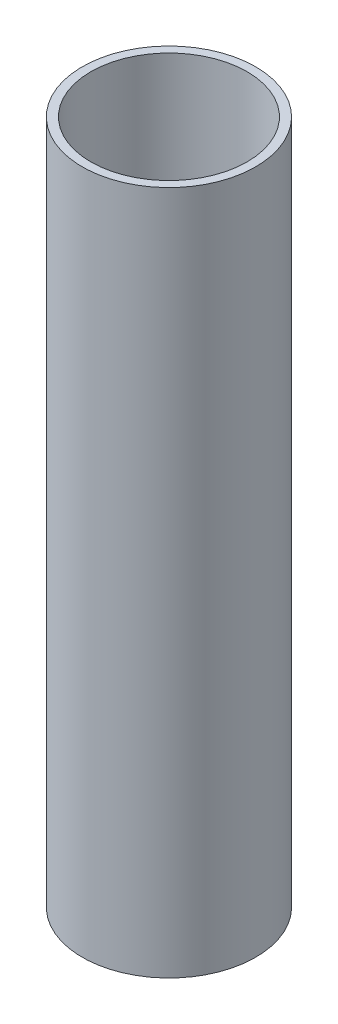
ISO-10303-21;
HEADER;
FILE_DESCRIPTION(('STEP AP214'),'2;1');
FILE_NAME('part.step','',(''),(''),'','','');
FILE_SCHEMA(('AUTOMOTIVE_DESIGN { 1 0 10303 214 1 1 1 1 }'));
ENDSEC;
DATA;
#1=APPLICATION_CONTEXT('core data for automotive mechanical design processes');
#2=APPLICATION_PROTOCOL_DEFINITION('international standard','automotive_design',2000,#1);
#3=PRODUCT_CONTEXT('',#1,'mechanical');
#4=PRODUCT('Part','Part','',(#3));
#5=PRODUCT_RELATED_PRODUCT_CATEGORY('part','',(#4));
#6=PRODUCT_DEFINITION_FORMATION('','',#4);
#7=PRODUCT_DEFINITION_CONTEXT('part definition',#1,'design');
#8=PRODUCT_DEFINITION('design','',#6,#7);
#9=PRODUCT_DEFINITION_SHAPE('','',#8);
#10=(LENGTH_UNIT() NAMED_UNIT(*) SI_UNIT(.MILLI.,.METRE.));
#11=(NAMED_UNIT(*) PLANE_ANGLE_UNIT() SI_UNIT($,.RADIAN.));
#12=(NAMED_UNIT(*) SI_UNIT($,.STERADIAN.) SOLID_ANGLE_UNIT());
#13=UNCERTAINTY_MEASURE_WITH_UNIT(LENGTH_MEASURE(1.E-05),#10,'distance_accuracy_value','');
#14=(GEOMETRIC_REPRESENTATION_CONTEXT(3) GLOBAL_UNCERTAINTY_ASSIGNED_CONTEXT((#13)) GLOBAL_UNIT_ASSIGNED_CONTEXT((#10,
#11,#12)) REPRESENTATION_CONTEXT('',''));
#15=CARTESIAN_POINT('',(0.,0.,0.));
#16=DIRECTION('',(0.,0.,1.));
#17=DIRECTION('',(1.,0.,0.));
#18=AXIS2_PLACEMENT_3D('',#15,#16,#17);
#19=CARTESIAN_POINT('',(0.,76.2,0.));
#20=DIRECTION('',(0.,-1.,0.));
#21=DIRECTION('',(0.,0.,-1.));
#22=AXIS2_PLACEMENT_3D('',#19,#20,#21);
#23=CYLINDRICAL_SURFACE('',#22,19.304);
#24=CARTESIAN_POINT('',(0.,76.2,0.));
#25=DIRECTION('',(0.,1.,0.));
#26=DIRECTION('',(0.,0.,1.));
#27=AXIS2_PLACEMENT_3D('',#24,#25,#26);
#28=CIRCLE('',#27,19.304);
#29=CARTESIAN_POINT('',(0.,76.2,-19.304));
#30=VERTEX_POINT('',#29);
#31=EDGE_CURVE('E10',#30,#30,#28,.T.);
#32=CARTESIAN_POINT('',(0.,-76.2,0.));
#33=DIRECTION('',(0.,1.,0.));
#34=DIRECTION('',(0.,0.,1.));
#35=AXIS2_PLACEMENT_3D('',#32,#33,#34);
#36=CIRCLE('',#35,19.304);
#37=CARTESIAN_POINT('',(0.,-76.2,-19.304));
#38=VERTEX_POINT('',#37);
#39=EDGE_CURVE('E40',#38,#38,#36,.T.);
#40=CARTESIAN_POINT('',(0.,76.2,-19.304));
#41=CARTESIAN_POINT('',(0.,74.6125,-19.304));
#42=CARTESIAN_POINT('',(0.,73.025,-19.304));
#43=CARTESIAN_POINT('',(0.,69.85,-19.304));
#44=CARTESIAN_POINT('',(0.,68.2625,-19.304));
#45=CARTESIAN_POINT('',(0.,65.0875,-19.304));
#46=CARTESIAN_POINT('',(0.,63.5,-19.304));
#47=CARTESIAN_POINT('',(0.,60.325,-19.304));
#48=CARTESIAN_POINT('',(0.,58.7375,-19.304));
#49=CARTESIAN_POINT('',(0.,55.5625,-19.304));
#50=CARTESIAN_POINT('',(0.,53.975,-19.304));
#51=CARTESIAN_POINT('',(0.,50.8,-19.304));
#52=CARTESIAN_POINT('',(0.,49.2125,-19.304));
#53=CARTESIAN_POINT('',(0.,46.0375,-19.304));
#54=CARTESIAN_POINT('',(0.,44.45,-19.304));
#55=CARTESIAN_POINT('',(0.,41.275,-19.304));
#56=CARTESIAN_POINT('',(0.,39.6875,-19.304));
#57=CARTESIAN_POINT('',(0.,36.5125,-19.304));
#58=CARTESIAN_POINT('',(0.,34.925,-19.304));
#59=CARTESIAN_POINT('',(0.,31.75,-19.304));
#60=CARTESIAN_POINT('',(0.,30.1625,-19.304));
#61=CARTESIAN_POINT('',(0.,26.9875,-19.304));
#62=CARTESIAN_POINT('',(0.,25.4,-19.304));
#63=CARTESIAN_POINT('',(0.,22.225,-19.304));
#64=CARTESIAN_POINT('',(0.,20.6375,-19.304));
#65=CARTESIAN_POINT('',(0.,17.4625,-19.304));
#66=CARTESIAN_POINT('',(0.,15.875,-19.304));
#67=CARTESIAN_POINT('',(0.,12.7,-19.304));
#68=CARTESIAN_POINT('',(0.,11.1125,-19.304));
#69=CARTESIAN_POINT('',(0.,7.93750000000001,-19.304));
#70=CARTESIAN_POINT('',(0.,6.35,-19.304));
#71=CARTESIAN_POINT('',(0.,3.175,-19.304));
#72=CARTESIAN_POINT('',(0.,1.5875,-19.304));
#73=CARTESIAN_POINT('',(0.,-1.5875,-19.304));
#74=CARTESIAN_POINT('',(0.,-3.175,-19.304));
#75=CARTESIAN_POINT('',(0.,-6.35,-19.304));
#76=CARTESIAN_POINT('',(0.,-7.93750000000001,-19.304));
#77=CARTESIAN_POINT('',(0.,-11.1125,-19.304));
#78=CARTESIAN_POINT('',(0.,-12.7,-19.304));
#79=CARTESIAN_POINT('',(0.,-15.875,-19.304));
#80=CARTESIAN_POINT('',(0.,-17.4625,-19.304));
#81=CARTESIAN_POINT('',(0.,-20.6375,-19.304));
#82=CARTESIAN_POINT('',(0.,-22.225,-19.304));
#83=CARTESIAN_POINT('',(0.,-25.4,-19.304));
#84=CARTESIAN_POINT('',(0.,-26.9875,-19.304));
#85=CARTESIAN_POINT('',(0.,-30.1625,-19.304));
#86=CARTESIAN_POINT('',(0.,-31.75,-19.304));
#87=CARTESIAN_POINT('',(0.,-34.925,-19.304));
#88=CARTESIAN_POINT('',(0.,-36.5125,-19.304));
#89=CARTESIAN_POINT('',(0.,-39.6875,-19.304));
#90=CARTESIAN_POINT('',(0.,-41.275,-19.304));
#91=CARTESIAN_POINT('',(0.,-44.45,-19.304));
#92=CARTESIAN_POINT('',(0.,-46.0375,-19.304));
#93=CARTESIAN_POINT('',(0.,-49.2125,-19.304));
#94=CARTESIAN_POINT('',(0.,-50.8,-19.304));
#95=CARTESIAN_POINT('',(0.,-53.975,-19.304));
#96=CARTESIAN_POINT('',(0.,-55.5625,-19.304));
#97=CARTESIAN_POINT('',(0.,-58.7375,-19.304));
#98=CARTESIAN_POINT('',(0.,-60.325,-19.304));
#99=CARTESIAN_POINT('',(0.,-63.5,-19.304));
#100=CARTESIAN_POINT('',(0.,-65.0875,-19.304));
#101=CARTESIAN_POINT('',(0.,-68.2625,-19.304));
#102=CARTESIAN_POINT('',(0.,-69.85,-19.304));
#103=CARTESIAN_POINT('',(0.,-73.025,-19.304));
#104=CARTESIAN_POINT('',(0.,-74.6125,-19.304));
#105=CARTESIAN_POINT('',(0.,-76.2,-19.304));
#106=B_SPLINE_CURVE_WITH_KNOTS('',3,(#40,#41,#42,#43,#44,#45,#46,#47,#48,#49,#50,#51,#52,#53,
#54,#55,#56,#57,#58,#59,#60,#61,#62,#63,#64,#65,#66,#67,#68,#69,#70,#71,#72,#73,#74,#75,#76,#77,
#78,#79,#80,#81,#82,#83,#84,#85,#86,#87,#88,#89,#90,#91,#92,#93,#94,#95,#96,#97,#98,#99,#100,
#101,#102,#103,#104,#105),.UNSPECIFIED.,.F.,.F.,(4,2,2,2,2,2,2,2,2,2,2,2,2,2,2,2,2,2,2,2,2,2,2,
2,2,2,2,2,2,2,2,2,4),(0.,4.7625,9.52500000000001,14.2875,19.05,23.8125,28.575,33.3375,38.1,
42.8625,47.625,52.3875,57.15,61.9125,66.675,71.4375,76.2,80.9625,85.725,90.4875,95.25,100.0125,
104.775,109.5375,114.3,119.0625,123.825,128.5875,133.35,138.1125,142.875,147.6375,152.4),.UNSPECIFIED.);
#107=EDGE_CURVE('BSEAM37',#30,#38,#106,.T.);
#108=ORIENTED_EDGE('',*,*,#31,.F.);
#109=ORIENTED_EDGE('',*,*,#39,.T.);
#110=ORIENTED_EDGE('',*,*,#107,.T.);
#111=ORIENTED_EDGE('',*,*,#107,.F.);
#112=EDGE_LOOP('',(#108,#110,#109,#111));
#113=FACE_BOUND('',#112,.T.);
#114=ADVANCED_FACE('F37',(#113),#23,.T.);
#115=CARTESIAN_POINT('',(0.,76.2,0.));
#116=DIRECTION('',(0.,1.,0.));
#117=DIRECTION('',(0.,0.,1.));
#118=AXIS2_PLACEMENT_3D('',#115,#116,#117);
#119=PLANE('',#118);
#120=CARTESIAN_POINT('',(0.,76.2,0.));
#121=DIRECTION('',(0.,1.,0.));
#122=DIRECTION('',(0.,0.,1.));
#123=AXIS2_PLACEMENT_3D('',#120,#121,#122);
#124=CIRCLE('',#123,17.399);
#125=CARTESIAN_POINT('',(0.,76.2,17.399));
#126=VERTEX_POINT('',#125);
#127=EDGE_CURVE('E51',#126,#126,#124,.T.);
#128=ORIENTED_EDGE('',*,*,#127,.F.);
#129=EDGE_LOOP('',(#128));
#130=FACE_BOUND('',#129,.T.);
#131=ORIENTED_EDGE('',*,*,#31,.T.);
#132=EDGE_LOOP('',(#131));
#133=FACE_BOUND('',#132,.T.);
#134=ADVANCED_FACE('F68',(#130,#133),#119,.T.);
#135=CARTESIAN_POINT('',(0.,-76.2,0.));
#136=DIRECTION('',(0.,1.,0.));
#137=DIRECTION('',(0.,0.,1.));
#138=AXIS2_PLACEMENT_3D('',#135,#136,#137);
#139=PLANE('',#138);
#140=CARTESIAN_POINT('',(0.,-76.2,0.));
#141=DIRECTION('',(0.,1.,0.));
#142=DIRECTION('',(0.,0.,1.));
#143=AXIS2_PLACEMENT_3D('',#140,#141,#142);
#144=CIRCLE('',#143,17.399);
#145=CARTESIAN_POINT('',(0.,-76.2,17.399));
#146=VERTEX_POINT('',#145);
#147=EDGE_CURVE('E49',#146,#146,#144,.T.);
#148=ORIENTED_EDGE('',*,*,#147,.T.);
#149=EDGE_LOOP('',(#148));
#150=FACE_BOUND('',#149,.T.);
#151=ORIENTED_EDGE('',*,*,#39,.F.);
#152=EDGE_LOOP('',(#151));
#153=FACE_BOUND('',#152,.T.);
#154=ADVANCED_FACE('F59',(#150,#153),#139,.F.);
#155=CARTESIAN_POINT('',(0.,-76.2,0.));
#156=DIRECTION('',(0.,1.,0.));
#157=DIRECTION('',(0.,0.,1.));
#158=AXIS2_PLACEMENT_3D('',#155,#156,#157);
#159=CYLINDRICAL_SURFACE('',#158,17.399);
#160=CARTESIAN_POINT('',(0.,-76.2,17.399));
#161=CARTESIAN_POINT('',(0.,-74.6125,17.399));
#162=CARTESIAN_POINT('',(0.,-73.025,17.399));
#163=CARTESIAN_POINT('',(0.,-69.85,17.399));
#164=CARTESIAN_POINT('',(0.,-68.2625,17.399));
#165=CARTESIAN_POINT('',(0.,-65.0875,17.399));
#166=CARTESIAN_POINT('',(0.,-63.5,17.399));
#167=CARTESIAN_POINT('',(0.,-60.325,17.399));
#168=CARTESIAN_POINT('',(0.,-58.7375,17.399));
#169=CARTESIAN_POINT('',(0.,-55.5625,17.399));
#170=CARTESIAN_POINT('',(0.,-53.975,17.399));
#171=CARTESIAN_POINT('',(0.,-50.8,17.399));
#172=CARTESIAN_POINT('',(0.,-49.2125,17.399));
#173=CARTESIAN_POINT('',(0.,-46.0375,17.399));
#174=CARTESIAN_POINT('',(0.,-44.45,17.399));
#175=CARTESIAN_POINT('',(0.,-41.275,17.399));
#176=CARTESIAN_POINT('',(0.,-39.6875,17.399));
#177=CARTESIAN_POINT('',(0.,-36.5125,17.399));
#178=CARTESIAN_POINT('',(0.,-34.925,17.399));
#179=CARTESIAN_POINT('',(0.,-31.75,17.399));
#180=CARTESIAN_POINT('',(0.,-30.1625,17.399));
#181=CARTESIAN_POINT('',(0.,-26.9875,17.399));
#182=CARTESIAN_POINT('',(0.,-25.4,17.399));
#183=CARTESIAN_POINT('',(0.,-22.225,17.399));
#184=CARTESIAN_POINT('',(0.,-20.6375,17.399));
#185=CARTESIAN_POINT('',(0.,-17.4625,17.399));
#186=CARTESIAN_POINT('',(0.,-15.875,17.399));
#187=CARTESIAN_POINT('',(0.,-12.7,17.399));
#188=CARTESIAN_POINT('',(0.,-11.1125,17.399));
#189=CARTESIAN_POINT('',(0.,-7.93750000000001,17.399));
#190=CARTESIAN_POINT('',(0.,-6.35,17.399));
#191=CARTESIAN_POINT('',(0.,-3.175,17.399));
#192=CARTESIAN_POINT('',(0.,-1.5875,17.399));
#193=CARTESIAN_POINT('',(0.,1.5875,17.399));
#194=CARTESIAN_POINT('',(0.,3.175,17.399));
#195=CARTESIAN_POINT('',(0.,6.35,17.399));
#196=CARTESIAN_POINT('',(0.,7.93750000000001,17.399));
#197=CARTESIAN_POINT('',(0.,11.1125,17.399));
#198=CARTESIAN_POINT('',(0.,12.7,17.399));
#199=CARTESIAN_POINT('',(0.,15.875,17.399));
#200=CARTESIAN_POINT('',(0.,17.4625,17.399));
#201=CARTESIAN_POINT('',(0.,20.6375,17.399));
#202=CARTESIAN_POINT('',(0.,22.225,17.399));
#203=CARTESIAN_POINT('',(0.,25.4,17.399));
#204=CARTESIAN_POINT('',(0.,26.9875,17.399));
#205=CARTESIAN_POINT('',(0.,30.1625,17.399));
#206=CARTESIAN_POINT('',(0.,31.75,17.399));
#207=CARTESIAN_POINT('',(0.,34.925,17.399));
#208=CARTESIAN_POINT('',(0.,36.5125,17.399));
#209=CARTESIAN_POINT('',(0.,39.6875,17.399));
#210=CARTESIAN_POINT('',(0.,41.275,17.399));
#211=CARTESIAN_POINT('',(0.,44.45,17.399));
#212=CARTESIAN_POINT('',(0.,46.0375,17.399));
#213=CARTESIAN_POINT('',(0.,49.2125,17.399));
#214=CARTESIAN_POINT('',(0.,50.8,17.399));
#215=CARTESIAN_POINT('',(0.,53.975,17.399));
#216=CARTESIAN_POINT('',(0.,55.5625,17.399));
#217=CARTESIAN_POINT('',(0.,58.7375,17.399));
#218=CARTESIAN_POINT('',(0.,60.325,17.399));
#219=CARTESIAN_POINT('',(0.,63.5,17.399));
#220=CARTESIAN_POINT('',(0.,65.0875,17.399));
#221=CARTESIAN_POINT('',(0.,68.2625,17.399));
#222=CARTESIAN_POINT('',(0.,69.85,17.399));
#223=CARTESIAN_POINT('',(0.,73.025,17.399));
#224=CARTESIAN_POINT('',(0.,74.6125,17.399));
#225=CARTESIAN_POINT('',(0.,76.2,17.399));
#226=B_SPLINE_CURVE_WITH_KNOTS('',3,(#160,#161,#162,#163,#164,#165,#166,#167,#168,#169,#170,
#171,#172,#173,#174,#175,#176,#177,#178,#179,#180,#181,#182,#183,#184,#185,#186,#187,#188,#189,
#190,#191,#192,#193,#194,#195,#196,#197,#198,#199,#200,#201,#202,#203,#204,#205,#206,#207,#208,
#209,#210,#211,#212,#213,#214,#215,#216,#217,#218,#219,#220,#221,#222,#223,#224,#225),
.UNSPECIFIED.,.F.,.F.,(4,2,2,2,2,2,2,2,2,2,2,2,2,2,2,2,2,2,2,2,2,2,2,2,2,2,2,2,2,2,2,2,4),(0.,
4.76249999999999,9.52499999999999,14.2875,19.05,23.8125,28.575,33.3375,38.1,42.8625,47.625,
52.3875,57.15,61.9125,66.675,71.4375,76.2,80.9625,85.725,90.4875,95.25,100.0125,104.775,
109.5375,114.3,119.0625,123.825,128.5875,133.35,138.1125,142.875,147.6375,152.4),.UNSPECIFIED.);
#227=EDGE_CURVE('BSEAM62',#146,#126,#226,.T.);
#228=ORIENTED_EDGE('',*,*,#147,.F.);
#229=ORIENTED_EDGE('',*,*,#127,.T.);
#230=ORIENTED_EDGE('',*,*,#227,.T.);
#231=ORIENTED_EDGE('',*,*,#227,.F.);
#232=EDGE_LOOP('',(#228,#230,#229,#231));
#233=FACE_BOUND('',#232,.T.);
#234=ADVANCED_FACE('F62',(#233),#159,.F.);
#235=CLOSED_SHELL('',(#114,#134,#154,#234));
#236=MANIFOLD_SOLID_BREP('B2',#235);
#237=ADVANCED_BREP_SHAPE_REPRESENTATION('',(#18,#236),#14);
#238=SHAPE_DEFINITION_REPRESENTATION(#9,#237);
ENDSEC;
END-ISO-10303-21;
